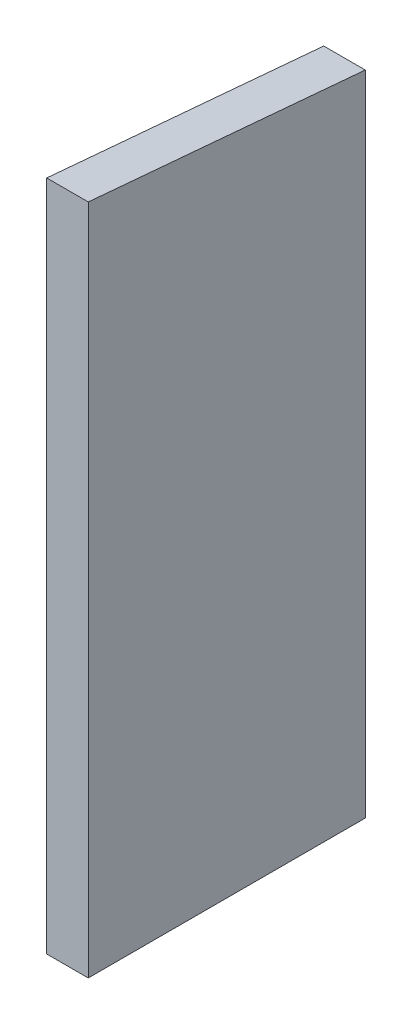
ISO-10303-21;
HEADER;
FILE_DESCRIPTION(('STEP AP214'),'2;1');
FILE_NAME('part.step','',(''),(''),'','','');
FILE_SCHEMA(('AUTOMOTIVE_DESIGN { 1 0 10303 214 1 1 1 1 }'));
ENDSEC;
DATA;
#1=APPLICATION_CONTEXT('core data for automotive mechanical design processes');
#2=APPLICATION_PROTOCOL_DEFINITION('international standard','automotive_design',2000,#1);
#3=PRODUCT_CONTEXT('',#1,'mechanical');
#4=PRODUCT('Part','Part','',(#3));
#5=PRODUCT_RELATED_PRODUCT_CATEGORY('part','',(#4));
#6=PRODUCT_DEFINITION_FORMATION('','',#4);
#7=PRODUCT_DEFINITION_CONTEXT('part definition',#1,'design');
#8=PRODUCT_DEFINITION('design','',#6,#7);
#9=PRODUCT_DEFINITION_SHAPE('','',#8);
#10=(LENGTH_UNIT() NAMED_UNIT(*) SI_UNIT(.MILLI.,.METRE.));
#11=(NAMED_UNIT(*) PLANE_ANGLE_UNIT() SI_UNIT($,.RADIAN.));
#12=(NAMED_UNIT(*) SI_UNIT($,.STERADIAN.) SOLID_ANGLE_UNIT());
#13=UNCERTAINTY_MEASURE_WITH_UNIT(LENGTH_MEASURE(1.E-05),#10,'distance_accuracy_value','');
#14=(GEOMETRIC_REPRESENTATION_CONTEXT(3) GLOBAL_UNCERTAINTY_ASSIGNED_CONTEXT((#13)) GLOBAL_UNIT_ASSIGNED_CONTEXT((#10,
#11,#12)) REPRESENTATION_CONTEXT('',''));
#15=CARTESIAN_POINT('',(0.,0.,0.));
#16=DIRECTION('',(0.,0.,1.));
#17=DIRECTION('',(1.,0.,0.));
#18=AXIS2_PLACEMENT_3D('',#15,#16,#17);
#19=CARTESIAN_POINT('',(7.5,243.23,50.));
#20=DIRECTION('',(-1.,0.,0.));
#21=DIRECTION('',(0.,0.,1.));
#22=AXIS2_PLACEMENT_3D('',#19,#20,#21);
#23=PLANE('',#22);
#24=DIRECTION('',(0.,-1.,0.));
#25=VECTOR('',#24,1.);
#26=CARTESIAN_POINT('',(7.5,243.23,-50.));
#27=LINE('',#26,#25);
#28=CARTESIAN_POINT('',(7.5,233.853168779401,-50.));
#29=VERTEX_POINT('',#28);
#30=CARTESIAN_POINT('',(7.5,0.,-50.));
#31=VERTEX_POINT('',#30);
#32=EDGE_CURVE('E11',#29,#31,#27,.T.);
#33=ORIENTED_EDGE('',*,*,#32,.F.);
#34=DIRECTION('',(0.,-0.0871557427476534,-0.996194698091746));
#35=VECTOR('',#34,1.);
#36=CARTESIAN_POINT('',(7.5,242.602035131993,50.));
#37=LINE('',#36,#35);
#38=CARTESIAN_POINT('',(7.5,242.602035131993,50.));
#39=VERTEX_POINT('',#38);
#40=EDGE_CURVE('E78',#39,#29,#37,.T.);
#41=ORIENTED_EDGE('',*,*,#40,.F.);
#42=DIRECTION('',(0.,-1.,0.));
#43=VECTOR('',#42,1.);
#44=CARTESIAN_POINT('',(7.5,243.23,50.));
#45=LINE('',#44,#43);
#46=CARTESIAN_POINT('',(7.5,0.,50.));
#47=VERTEX_POINT('',#46);
#48=EDGE_CURVE('E59',#39,#47,#45,.T.);
#49=ORIENTED_EDGE('',*,*,#48,.T.);
#50=DIRECTION('',(0.,0.,-1.));
#51=VECTOR('',#50,1.);
#52=CARTESIAN_POINT('',(7.5,0.,50.));
#53=LINE('',#52,#51);
#54=EDGE_CURVE('E82',#47,#31,#53,.T.);
#55=ORIENTED_EDGE('',*,*,#54,.T.);
#56=EDGE_LOOP('',(#33,#41,#49,#55));
#57=FACE_BOUND('',#56,.T.);
#58=ADVANCED_FACE('F37',(#57),#23,.F.);
#59=CARTESIAN_POINT('',(-7.5,243.23,-50.));
#60=DIRECTION('',(0.,0.,1.));
#61=DIRECTION('',(1.,0.,0.));
#62=AXIS2_PLACEMENT_3D('',#59,#60,#61);
#63=PLANE('',#62);
#64=DIRECTION('',(0.,-1.,0.));
#65=VECTOR('',#64,1.);
#66=CARTESIAN_POINT('',(-7.5,243.23,-50.));
#67=LINE('',#66,#65);
#68=CARTESIAN_POINT('',(-7.5,233.853168779401,-50.));
#69=VERTEX_POINT('',#68);
#70=CARTESIAN_POINT('',(-7.5,0.,-50.));
#71=VERTEX_POINT('',#70);
#72=EDGE_CURVE('E44',#69,#71,#67,.T.);
#73=ORIENTED_EDGE('',*,*,#72,.F.);
#74=DIRECTION('',(1.,0.,0.));
#75=VECTOR('',#74,1.);
#76=CARTESIAN_POINT('',(-7.5,233.853168779401,-50.));
#77=LINE('',#76,#75);
#78=EDGE_CURVE('E76',#69,#29,#77,.T.);
#79=ORIENTED_EDGE('',*,*,#78,.T.);
#80=ORIENTED_EDGE('',*,*,#32,.T.);
#81=DIRECTION('',(-1.,0.,0.));
#82=VECTOR('',#81,1.);
#83=CARTESIAN_POINT('',(-7.5,0.,-50.));
#84=LINE('',#83,#82);
#85=EDGE_CURVE('E94',#31,#71,#84,.T.);
#86=ORIENTED_EDGE('',*,*,#85,.T.);
#87=EDGE_LOOP('',(#73,#79,#80,#86));
#88=FACE_BOUND('',#87,.T.);
#89=ADVANCED_FACE('F92',(#88),#63,.F.);
#90=CARTESIAN_POINT('',(-7.5,243.23,50.));
#91=DIRECTION('',(1.,0.,0.));
#92=DIRECTION('',(0.,0.,-1.));
#93=AXIS2_PLACEMENT_3D('',#90,#91,#92);
#94=PLANE('',#93);
#95=DIRECTION('',(0.,-1.,0.));
#96=VECTOR('',#95,1.);
#97=CARTESIAN_POINT('',(-7.5,243.23,50.));
#98=LINE('',#97,#96);
#99=CARTESIAN_POINT('',(-7.5,242.602035131993,50.));
#100=VERTEX_POINT('',#99);
#101=CARTESIAN_POINT('',(-7.5,0.,50.));
#102=VERTEX_POINT('',#101);
#103=EDGE_CURVE('E90',#100,#102,#98,.T.);
#104=ORIENTED_EDGE('',*,*,#103,.F.);
#105=DIRECTION('',(0.,-0.0871557427476534,-0.996194698091746));
#106=VECTOR('',#105,1.);
#107=CARTESIAN_POINT('',(-7.5,242.602035131993,50.));
#108=LINE('',#107,#106);
#109=EDGE_CURVE('E51',#100,#69,#108,.T.);
#110=ORIENTED_EDGE('',*,*,#109,.T.);
#111=ORIENTED_EDGE('',*,*,#72,.T.);
#112=DIRECTION('',(0.,0.,1.));
#113=VECTOR('',#112,1.);
#114=CARTESIAN_POINT('',(-7.5,0.,50.));
#115=LINE('',#114,#113);
#116=EDGE_CURVE('E101',#71,#102,#115,.T.);
#117=ORIENTED_EDGE('',*,*,#116,.T.);
#118=EDGE_LOOP('',(#104,#110,#111,#117));
#119=FACE_BOUND('',#118,.T.);
#120=ADVANCED_FACE('F87',(#119),#94,.F.);
#121=CARTESIAN_POINT('',(-7.5,243.23,50.));
#122=DIRECTION('',(0.,0.,-1.));
#123=DIRECTION('',(-1.,0.,0.));
#124=AXIS2_PLACEMENT_3D('',#121,#122,#123);
#125=PLANE('',#124);
#126=ORIENTED_EDGE('',*,*,#48,.F.);
#127=DIRECTION('',(1.,0.,0.));
#128=VECTOR('',#127,1.);
#129=CARTESIAN_POINT('',(-7.5,242.602035131993,50.));
#130=LINE('',#129,#128);
#131=EDGE_CURVE('E83',#100,#39,#130,.T.);
#132=ORIENTED_EDGE('',*,*,#131,.F.);
#133=ORIENTED_EDGE('',*,*,#103,.T.);
#134=DIRECTION('',(1.,0.,0.));
#135=VECTOR('',#134,1.);
#136=CARTESIAN_POINT('',(-7.5,0.,50.));
#137=LINE('',#136,#135);
#138=EDGE_CURVE('E99',#102,#47,#137,.T.);
#139=ORIENTED_EDGE('',*,*,#138,.T.);
#140=EDGE_LOOP('',(#126,#132,#133,#139));
#141=FACE_BOUND('',#140,.T.);
#142=ADVANCED_FACE('F107',(#141),#125,.F.);
#143=CARTESIAN_POINT('',(0.,0.,0.));
#144=DIRECTION('',(0.,-1.,0.));
#145=DIRECTION('',(0.,0.,-1.));
#146=AXIS2_PLACEMENT_3D('',#143,#144,#145);
#147=PLANE('',#146);
#148=ORIENTED_EDGE('',*,*,#54,.F.);
#149=ORIENTED_EDGE('',*,*,#138,.F.);
#150=ORIENTED_EDGE('',*,*,#116,.F.);
#151=ORIENTED_EDGE('',*,*,#85,.F.);
#152=EDGE_LOOP('',(#148,#149,#150,#151));
#153=FACE_BOUND('',#152,.T.);
#154=ADVANCED_FACE('F111',(#153),#147,.T.);
#155=CARTESIAN_POINT('',(-7.5,242.602035131993,50.));
#156=DIRECTION('',(0.,-0.996194698091746,0.0871557427476534));
#157=DIRECTION('',(0.,-0.0871557427476534,-0.996194698091746));
#158=AXIS2_PLACEMENT_3D('',#155,#156,#157);
#159=PLANE('',#158);
#160=ORIENTED_EDGE('',*,*,#40,.T.);
#161=ORIENTED_EDGE('',*,*,#78,.F.);
#162=ORIENTED_EDGE('',*,*,#109,.F.);
#163=ORIENTED_EDGE('',*,*,#131,.T.);
#164=EDGE_LOOP('',(#160,#161,#162,#163));
#165=FACE_BOUND('',#164,.T.);
#166=ADVANCED_FACE('F77',(#165),#159,.F.);
#167=CLOSED_SHELL('',(#58,#89,#120,#142,#154,#166));
#168=MANIFOLD_SOLID_BREP('B2',#167);
#169=ADVANCED_BREP_SHAPE_REPRESENTATION('',(#18,#168),#14);
#170=SHAPE_DEFINITION_REPRESENTATION(#9,#169);
ENDSEC;
END-ISO-10303-21;
